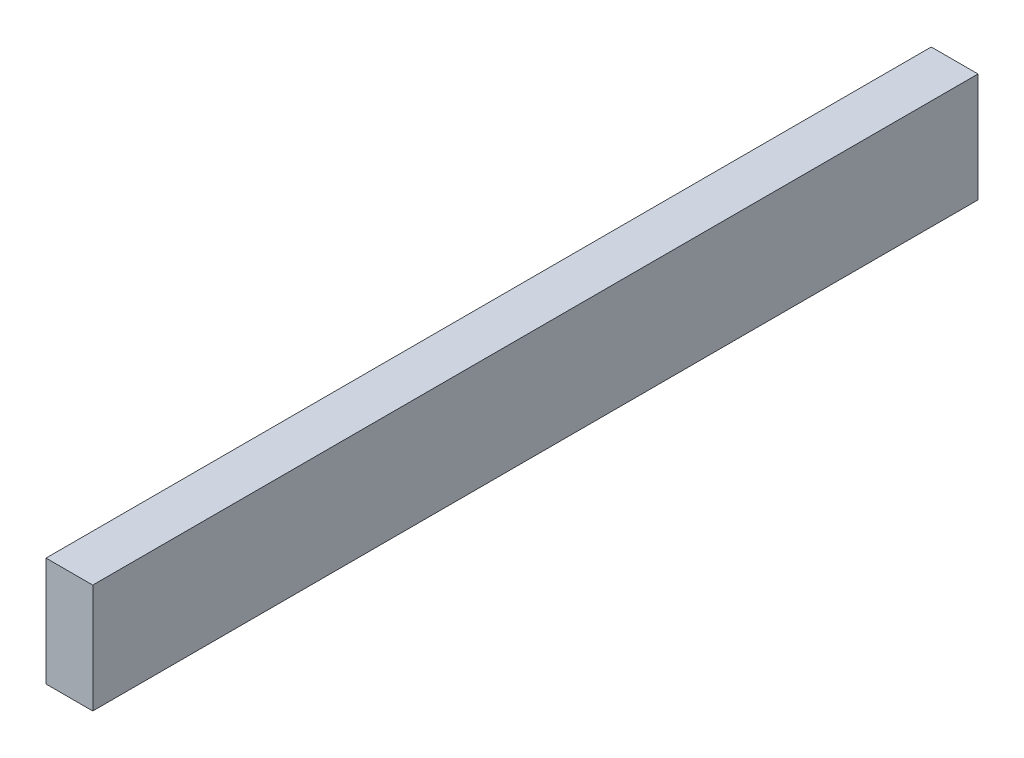
ISO-10303-21;
HEADER;
FILE_DESCRIPTION(('STEP AP214'),'2;1');
FILE_NAME('part.step','',(''),(''),'','','');
FILE_SCHEMA(('AUTOMOTIVE_DESIGN { 1 0 10303 214 1 1 1 1 }'));
ENDSEC;
DATA;
#1=APPLICATION_CONTEXT('core data for automotive mechanical design processes');
#2=APPLICATION_PROTOCOL_DEFINITION('international standard','automotive_design',2000,#1);
#3=PRODUCT_CONTEXT('',#1,'mechanical');
#4=PRODUCT('Part','Part','',(#3));
#5=PRODUCT_RELATED_PRODUCT_CATEGORY('part','',(#4));
#6=PRODUCT_DEFINITION_FORMATION('','',#4);
#7=PRODUCT_DEFINITION_CONTEXT('part definition',#1,'design');
#8=PRODUCT_DEFINITION('design','',#6,#7);
#9=PRODUCT_DEFINITION_SHAPE('','',#8);
#10=(LENGTH_UNIT() NAMED_UNIT(*) SI_UNIT(.MILLI.,.METRE.));
#11=(NAMED_UNIT(*) PLANE_ANGLE_UNIT() SI_UNIT($,.RADIAN.));
#12=(NAMED_UNIT(*) SI_UNIT($,.STERADIAN.) SOLID_ANGLE_UNIT());
#13=UNCERTAINTY_MEASURE_WITH_UNIT(LENGTH_MEASURE(1.E-05),#10,'distance_accuracy_value','');
#14=(GEOMETRIC_REPRESENTATION_CONTEXT(3) GLOBAL_UNCERTAINTY_ASSIGNED_CONTEXT((#13)) GLOBAL_UNIT_ASSIGNED_CONTEXT((#10,
#11,#12)) REPRESENTATION_CONTEXT('',''));
#15=CARTESIAN_POINT('',(0.,0.,0.));
#16=DIRECTION('',(0.,0.,1.));
#17=DIRECTION('',(1.,0.,0.));
#18=AXIS2_PLACEMENT_3D('',#15,#16,#17);
#19=CARTESIAN_POINT('',(0.,0.,721.45));
#20=DIRECTION('',(1.,0.,0.));
#21=DIRECTION('',(0.,0.,-1.));
#22=AXIS2_PLACEMENT_3D('',#19,#20,#21);
#23=PLANE('',#22);
#24=DIRECTION('',(0.,-1.,0.));
#25=VECTOR('',#24,1.);
#26=CARTESIAN_POINT('',(0.,0.,0.));
#27=LINE('',#26,#25);
#28=CARTESIAN_POINT('',(0.,88.9,0.));
#29=VERTEX_POINT('',#28);
#30=CARTESIAN_POINT('',(0.,0.,0.));
#31=VERTEX_POINT('',#30);
#32=EDGE_CURVE('E104',#29,#31,#27,.T.);
#33=ORIENTED_EDGE('',*,*,#32,.T.);
#34=DIRECTION('',(0.,0.,-1.));
#35=VECTOR('',#34,1.);
#36=CARTESIAN_POINT('',(0.,0.,721.45));
#37=LINE('',#36,#35);
#38=CARTESIAN_POINT('',(0.,0.,721.45));
#39=VERTEX_POINT('',#38);
#40=EDGE_CURVE('E11',#39,#31,#37,.T.);
#41=ORIENTED_EDGE('',*,*,#40,.F.);
#42=DIRECTION('',(0.,-1.,0.));
#43=VECTOR('',#42,1.);
#44=CARTESIAN_POINT('',(0.,0.,721.45));
#45=LINE('',#44,#43);
#46=CARTESIAN_POINT('',(0.,88.9,721.45));
#47=VERTEX_POINT('',#46);
#48=EDGE_CURVE('E92',#47,#39,#45,.T.);
#49=ORIENTED_EDGE('',*,*,#48,.F.);
#50=DIRECTION('',(0.,0.,-1.));
#51=VECTOR('',#50,1.);
#52=CARTESIAN_POINT('',(0.,88.9,721.45));
#53=LINE('',#52,#51);
#54=EDGE_CURVE('E100',#47,#29,#53,.T.);
#55=ORIENTED_EDGE('',*,*,#54,.T.);
#56=EDGE_LOOP('',(#33,#41,#49,#55));
#57=FACE_BOUND('',#56,.T.);
#58=ADVANCED_FACE('F41',(#57),#23,.F.);
#59=CARTESIAN_POINT('',(0.,0.,721.45));
#60=DIRECTION('',(0.,1.,0.));
#61=DIRECTION('',(0.,0.,1.));
#62=AXIS2_PLACEMENT_3D('',#59,#60,#61);
#63=PLANE('',#62);
#64=DIRECTION('',(1.,0.,0.));
#65=VECTOR('',#64,1.);
#66=CARTESIAN_POINT('',(0.,0.,0.));
#67=LINE('',#66,#65);
#68=CARTESIAN_POINT('',(38.1,0.,0.));
#69=VERTEX_POINT('',#68);
#70=EDGE_CURVE('E96',#31,#69,#67,.T.);
#71=ORIENTED_EDGE('',*,*,#70,.T.);
#72=DIRECTION('',(0.,0.,-1.));
#73=VECTOR('',#72,1.);
#74=CARTESIAN_POINT('',(38.1,0.,721.45));
#75=LINE('',#74,#73);
#76=CARTESIAN_POINT('',(38.1,0.,721.45));
#77=VERTEX_POINT('',#76);
#78=EDGE_CURVE('E49',#77,#69,#75,.T.);
#79=ORIENTED_EDGE('',*,*,#78,.F.);
#80=DIRECTION('',(1.,0.,0.));
#81=VECTOR('',#80,1.);
#82=CARTESIAN_POINT('',(0.,0.,721.45));
#83=LINE('',#82,#81);
#84=EDGE_CURVE('E87',#39,#77,#83,.T.);
#85=ORIENTED_EDGE('',*,*,#84,.F.);
#86=ORIENTED_EDGE('',*,*,#40,.T.);
#87=EDGE_LOOP('',(#71,#79,#85,#86));
#88=FACE_BOUND('',#87,.T.);
#89=ADVANCED_FACE('F95',(#88),#63,.F.);
#90=CARTESIAN_POINT('',(38.1,0.,721.45));
#91=DIRECTION('',(-1.,0.,0.));
#92=DIRECTION('',(0.,0.,1.));
#93=AXIS2_PLACEMENT_3D('',#90,#91,#92);
#94=PLANE('',#93);
#95=DIRECTION('',(0.,1.,0.));
#96=VECTOR('',#95,1.);
#97=CARTESIAN_POINT('',(38.1,0.,0.));
#98=LINE('',#97,#96);
#99=CARTESIAN_POINT('',(38.1,88.9,0.));
#100=VERTEX_POINT('',#99);
#101=EDGE_CURVE('E74',#69,#100,#98,.T.);
#102=ORIENTED_EDGE('',*,*,#101,.T.);
#103=DIRECTION('',(0.,0.,-1.));
#104=VECTOR('',#103,1.);
#105=CARTESIAN_POINT('',(38.1,88.9,721.45));
#106=LINE('',#105,#104);
#107=CARTESIAN_POINT('',(38.1,88.9,721.45));
#108=VERTEX_POINT('',#107);
#109=EDGE_CURVE('E97',#108,#100,#106,.T.);
#110=ORIENTED_EDGE('',*,*,#109,.F.);
#111=DIRECTION('',(0.,1.,0.));
#112=VECTOR('',#111,1.);
#113=CARTESIAN_POINT('',(38.1,0.,721.45));
#114=LINE('',#113,#112);
#115=EDGE_CURVE('E90',#77,#108,#114,.T.);
#116=ORIENTED_EDGE('',*,*,#115,.F.);
#117=ORIENTED_EDGE('',*,*,#78,.T.);
#118=EDGE_LOOP('',(#102,#110,#116,#117));
#119=FACE_BOUND('',#118,.T.);
#120=ADVANCED_FACE('F98',(#119),#94,.F.);
#121=CARTESIAN_POINT('',(0.,88.9,721.45));
#122=DIRECTION('',(0.,-1.,0.));
#123=DIRECTION('',(0.,0.,-1.));
#124=AXIS2_PLACEMENT_3D('',#121,#122,#123);
#125=PLANE('',#124);
#126=DIRECTION('',(-1.,0.,0.));
#127=VECTOR('',#126,1.);
#128=CARTESIAN_POINT('',(0.,88.9,0.));
#129=LINE('',#128,#127);
#130=EDGE_CURVE('E80',#100,#29,#129,.T.);
#131=ORIENTED_EDGE('',*,*,#130,.T.);
#132=ORIENTED_EDGE('',*,*,#54,.F.);
#133=DIRECTION('',(-1.,0.,0.));
#134=VECTOR('',#133,1.);
#135=CARTESIAN_POINT('',(0.,88.9,721.45));
#136=LINE('',#135,#134);
#137=EDGE_CURVE('E57',#108,#47,#136,.T.);
#138=ORIENTED_EDGE('',*,*,#137,.F.);
#139=ORIENTED_EDGE('',*,*,#109,.T.);
#140=EDGE_LOOP('',(#131,#132,#138,#139));
#141=FACE_BOUND('',#140,.T.);
#142=ADVANCED_FACE('F111',(#141),#125,.F.);
#143=CARTESIAN_POINT('',(0.,0.,721.45));
#144=DIRECTION('',(0.,0.,-1.));
#145=DIRECTION('',(-1.,0.,0.));
#146=AXIS2_PLACEMENT_3D('',#143,#144,#145);
#147=PLANE('',#146);
#148=ORIENTED_EDGE('',*,*,#48,.T.);
#149=ORIENTED_EDGE('',*,*,#84,.T.);
#150=ORIENTED_EDGE('',*,*,#115,.T.);
#151=ORIENTED_EDGE('',*,*,#137,.T.);
#152=EDGE_LOOP('',(#148,#149,#150,#151));
#153=FACE_BOUND('',#152,.T.);
#154=ADVANCED_FACE('F88',(#153),#147,.F.);
#155=CARTESIAN_POINT('',(0.,0.,0.));
#156=DIRECTION('',(0.,0.,-1.));
#157=DIRECTION('',(-1.,0.,0.));
#158=AXIS2_PLACEMENT_3D('',#155,#156,#157);
#159=PLANE('',#158);
#160=ORIENTED_EDGE('',*,*,#32,.F.);
#161=ORIENTED_EDGE('',*,*,#130,.F.);
#162=ORIENTED_EDGE('',*,*,#101,.F.);
#163=ORIENTED_EDGE('',*,*,#70,.F.);
#164=EDGE_LOOP('',(#160,#161,#162,#163));
#165=FACE_BOUND('',#164,.T.);
#166=ADVANCED_FACE('F114',(#165),#159,.T.);
#167=CLOSED_SHELL('',(#58,#89,#120,#142,#154,#166));
#168=MANIFOLD_SOLID_BREP('B2',#167);
#169=ADVANCED_BREP_SHAPE_REPRESENTATION('',(#18,#168),#14);
#170=SHAPE_DEFINITION_REPRESENTATION(#9,#169);
ENDSEC;
END-ISO-10303-21;
